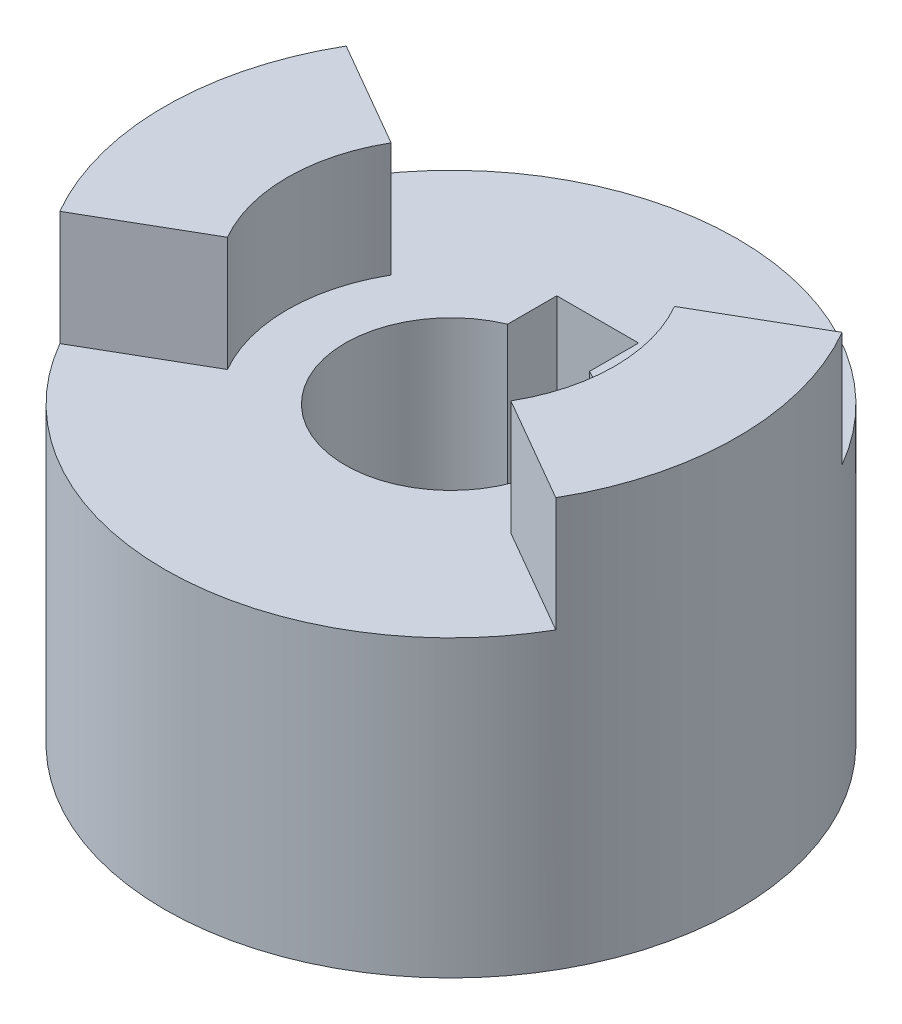
ISO-10303-21;
HEADER;
FILE_DESCRIPTION(('STEP AP214'),'2;1');
FILE_NAME('part.step','',(''),(''),'','','');
FILE_SCHEMA(('AUTOMOTIVE_DESIGN { 1 0 10303 214 1 1 1 1 }'));
ENDSEC;
DATA;
#1=APPLICATION_CONTEXT('core data for automotive mechanical design processes');
#2=APPLICATION_PROTOCOL_DEFINITION('international standard','automotive_design',2000,#1);
#3=PRODUCT_CONTEXT('',#1,'mechanical');
#4=PRODUCT('Part','Part','',(#3));
#5=PRODUCT_RELATED_PRODUCT_CATEGORY('part','',(#4));
#6=PRODUCT_DEFINITION_FORMATION('','',#4);
#7=PRODUCT_DEFINITION_CONTEXT('part definition',#1,'design');
#8=PRODUCT_DEFINITION('design','',#6,#7);
#9=PRODUCT_DEFINITION_SHAPE('','',#8);
#10=(LENGTH_UNIT() NAMED_UNIT(*) SI_UNIT(.MILLI.,.METRE.));
#11=(NAMED_UNIT(*) PLANE_ANGLE_UNIT() SI_UNIT($,.RADIAN.));
#12=(NAMED_UNIT(*) SI_UNIT($,.STERADIAN.) SOLID_ANGLE_UNIT());
#13=UNCERTAINTY_MEASURE_WITH_UNIT(LENGTH_MEASURE(1.E-05),#10,'distance_accuracy_value','');
#14=(GEOMETRIC_REPRESENTATION_CONTEXT(3) GLOBAL_UNCERTAINTY_ASSIGNED_CONTEXT((#13)) GLOBAL_UNIT_ASSIGNED_CONTEXT((#10,
#11,#12)) REPRESENTATION_CONTEXT('',''));
#15=CARTESIAN_POINT('',(0.,0.,0.));
#16=DIRECTION('',(0.,0.,1.));
#17=DIRECTION('',(1.,0.,0.));
#18=AXIS2_PLACEMENT_3D('',#15,#16,#17);
#19=CARTESIAN_POINT('',(10.3923048454132,-67.2011904656459,6.00000000000003));
#20=DIRECTION('',(0.499999999999996,0.,-0.866025403784441));
#21=DIRECTION('',(-0.866025403784441,0.,-0.499999999999996));
#22=AXIS2_PLACEMENT_3D('',#19,#20,#21);
#23=PLANE('',#22);
#24=DIRECTION('',(0.,-1.,0.));
#25=VECTOR('',#24,1.);
#26=CARTESIAN_POINT('',(17.3205080756888,50.,9.99999999999999));
#27=LINE('',#26,#25);
#28=CARTESIAN_POINT('',(17.3205080756888,36.,9.99999999999999));
#29=VERTEX_POINT('',#28);
#30=CARTESIAN_POINT('',(17.3205080756888,50.,9.99999999999999));
#31=VERTEX_POINT('',#30);
#32=EDGE_CURVE('E127',#29,#31,#27,.F.);
#33=ORIENTED_EDGE('',*,*,#32,.F.);
#34=DIRECTION('',(0.866025403784441,0.,0.499999999999996));
#35=VECTOR('',#34,1.);
#36=CARTESIAN_POINT('',(10.3923048454132,36.,6.00000000000003));
#37=LINE('',#36,#35);
#38=CARTESIAN_POINT('',(30.3108891324554,36.,17.4999999999999));
#39=VERTEX_POINT('',#38);
#40=EDGE_CURVE('E139',#29,#39,#37,.T.);
#41=ORIENTED_EDGE('',*,*,#40,.T.);
#42=DIRECTION('',(0.,1.,0.));
#43=VECTOR('',#42,1.);
#44=CARTESIAN_POINT('',(30.3108891324554,-67.2011904656459,17.4999999999999));
#45=LINE('',#44,#43);
#46=CARTESIAN_POINT('',(30.3108891324554,50.,17.4999999999999));
#47=VERTEX_POINT('',#46);
#48=EDGE_CURVE('E156',#39,#47,#45,.T.);
#49=ORIENTED_EDGE('',*,*,#48,.T.);
#50=DIRECTION('',(-0.866025403784441,0.,-0.499999999999996));
#51=VECTOR('',#50,1.);
#52=CARTESIAN_POINT('',(10.3923048454132,50.,6.00000000000003));
#53=LINE('',#52,#51);
#54=EDGE_CURVE('E142',#47,#31,#53,.T.);
#55=ORIENTED_EDGE('',*,*,#54,.T.);
#56=EDGE_LOOP('',(#33,#41,#49,#55));
#57=FACE_BOUND('',#56,.T.);
#58=ADVANCED_FACE('F35',(#57),#23,.F.);
#59=CARTESIAN_POINT('',(-10.3923048454133,-67.2011904656459,5.99999999999998));
#60=DIRECTION('',(-0.499999999999998,0.,-0.86602540378444));
#61=DIRECTION('',(-0.86602540378444,0.,0.499999999999998));
#62=AXIS2_PLACEMENT_3D('',#59,#60,#61);
#63=PLANE('',#62);
#64=DIRECTION('',(0.,-1.,0.));
#65=VECTOR('',#64,1.);
#66=CARTESIAN_POINT('',(-17.3205080756888,50.,9.99999999999996));
#67=LINE('',#66,#65);
#68=CARTESIAN_POINT('',(-17.3205080756888,50.,9.99999999999996));
#69=VERTEX_POINT('',#68);
#70=CARTESIAN_POINT('',(-17.3205080756888,36.,9.99999999999996));
#71=VERTEX_POINT('',#70);
#72=EDGE_CURVE('E143',#69,#71,#67,.T.);
#73=ORIENTED_EDGE('',*,*,#72,.F.);
#74=DIRECTION('',(-0.86602540378444,0.,0.499999999999998));
#75=VECTOR('',#74,1.);
#76=CARTESIAN_POINT('',(-10.3923048454133,50.,5.99999999999998));
#77=LINE('',#76,#75);
#78=CARTESIAN_POINT('',(-30.3108891324554,50.,17.4999999999999));
#79=VERTEX_POINT('',#78);
#80=EDGE_CURVE('E160',#69,#79,#77,.T.);
#81=ORIENTED_EDGE('',*,*,#80,.T.);
#82=DIRECTION('',(0.,1.,0.));
#83=VECTOR('',#82,1.);
#84=CARTESIAN_POINT('',(-30.3108891324554,-67.2011904656459,17.4999999999999));
#85=LINE('',#84,#83);
#86=CARTESIAN_POINT('',(-30.3108891324554,36.,17.4999999999999));
#87=VERTEX_POINT('',#86);
#88=EDGE_CURVE('E164',#87,#79,#85,.T.);
#89=ORIENTED_EDGE('',*,*,#88,.F.);
#90=DIRECTION('',(0.86602540378444,0.,-0.499999999999998));
#91=VECTOR('',#90,1.);
#92=CARTESIAN_POINT('',(-10.3923048454133,36.,5.99999999999998));
#93=LINE('',#92,#91);
#94=EDGE_CURVE('E151',#87,#71,#93,.T.);
#95=ORIENTED_EDGE('',*,*,#94,.T.);
#96=EDGE_LOOP('',(#73,#81,#89,#95));
#97=FACE_BOUND('',#96,.T.);
#98=ADVANCED_FACE('F233',(#97),#63,.F.);
#99=CARTESIAN_POINT('',(10.3923048454132,-67.2011904656459,-6.00000000000003));
#100=DIRECTION('',(-0.499999999999996,0.,-0.866025403784441));
#101=DIRECTION('',(-0.866025403784441,0.,0.499999999999996));
#102=AXIS2_PLACEMENT_3D('',#99,#100,#101);
#103=PLANE('',#102);
#104=DIRECTION('',(0.866025403784441,0.,-0.499999999999996));
#105=VECTOR('',#104,1.);
#106=CARTESIAN_POINT('',(10.3923048454132,36.,-6.00000000000003));
#107=LINE('',#106,#105);
#108=CARTESIAN_POINT('',(17.3205080756888,36.,-9.99999999999999));
#109=VERTEX_POINT('',#108);
#110=CARTESIAN_POINT('',(30.3108891324554,36.,-17.4999999999999));
#111=VERTEX_POINT('',#110);
#112=EDGE_CURVE('E203',#109,#111,#107,.T.);
#113=ORIENTED_EDGE('',*,*,#112,.F.);
#114=DIRECTION('',(0.,-1.,0.));
#115=VECTOR('',#114,1.);
#116=CARTESIAN_POINT('',(17.3205080756888,50.,-9.99999999999999));
#117=LINE('',#116,#115);
#118=CARTESIAN_POINT('',(17.3205080756888,50.,-9.99999999999999));
#119=VERTEX_POINT('',#118);
#120=EDGE_CURVE('E130',#109,#119,#117,.F.);
#121=ORIENTED_EDGE('',*,*,#120,.T.);
#122=DIRECTION('',(-0.866025403784441,0.,0.499999999999996));
#123=VECTOR('',#122,1.);
#124=CARTESIAN_POINT('',(10.3923048454132,50.,-6.00000000000003));
#125=LINE('',#124,#123);
#126=CARTESIAN_POINT('',(30.3108891324554,50.,-17.4999999999999));
#127=VERTEX_POINT('',#126);
#128=EDGE_CURVE('E194',#127,#119,#125,.T.);
#129=ORIENTED_EDGE('',*,*,#128,.F.);
#130=DIRECTION('',(0.,1.,0.));
#131=VECTOR('',#130,1.);
#132=CARTESIAN_POINT('',(30.3108891324554,-67.2011904656459,-17.4999999999999));
#133=LINE('',#132,#131);
#134=EDGE_CURVE('E210',#111,#127,#133,.T.);
#135=ORIENTED_EDGE('',*,*,#134,.F.);
#136=EDGE_LOOP('',(#113,#121,#129,#135));
#137=FACE_BOUND('',#136,.T.);
#138=ADVANCED_FACE('F219',(#137),#103,.T.);
#139=CARTESIAN_POINT('',(-10.3923048454133,-67.2011904656459,-5.99999999999998));
#140=DIRECTION('',(0.499999999999998,0.,-0.86602540378444));
#141=DIRECTION('',(-0.86602540378444,0.,-0.499999999999998));
#142=AXIS2_PLACEMENT_3D('',#139,#140,#141);
#143=PLANE('',#142);
#144=DIRECTION('',(-0.86602540378444,0.,-0.499999999999998));
#145=VECTOR('',#144,1.);
#146=CARTESIAN_POINT('',(-10.3923048454133,50.,-5.99999999999998));
#147=LINE('',#146,#145);
#148=CARTESIAN_POINT('',(-17.3205080756888,50.,-9.99999999999996));
#149=VERTEX_POINT('',#148);
#150=CARTESIAN_POINT('',(-30.3108891324554,50.,-17.4999999999999));
#151=VERTEX_POINT('',#150);
#152=EDGE_CURVE('E208',#149,#151,#147,.T.);
#153=ORIENTED_EDGE('',*,*,#152,.F.);
#154=DIRECTION('',(0.,-1.,0.));
#155=VECTOR('',#154,1.);
#156=CARTESIAN_POINT('',(-17.3205080756888,50.,-9.99999999999996));
#157=LINE('',#156,#155);
#158=CARTESIAN_POINT('',(-17.3205080756888,36.,-9.99999999999996));
#159=VERTEX_POINT('',#158);
#160=EDGE_CURVE('E228',#149,#159,#157,.T.);
#161=ORIENTED_EDGE('',*,*,#160,.T.);
#162=DIRECTION('',(0.86602540378444,0.,0.499999999999998));
#163=VECTOR('',#162,1.);
#164=CARTESIAN_POINT('',(-10.3923048454133,36.,-5.99999999999998));
#165=LINE('',#164,#163);
#166=CARTESIAN_POINT('',(-30.3108891324554,36.,-17.4999999999999));
#167=VERTEX_POINT('',#166);
#168=EDGE_CURVE('E162',#167,#159,#165,.T.);
#169=ORIENTED_EDGE('',*,*,#168,.F.);
#170=DIRECTION('',(0.,1.,0.));
#171=VECTOR('',#170,1.);
#172=CARTESIAN_POINT('',(-30.3108891324554,-67.2011904656459,-17.4999999999999));
#173=LINE('',#172,#171);
#174=EDGE_CURVE('E211',#167,#151,#173,.T.);
#175=ORIENTED_EDGE('',*,*,#174,.T.);
#176=EDGE_LOOP('',(#153,#161,#169,#175));
#177=FACE_BOUND('',#176,.T.);
#178=ADVANCED_FACE('F226',(#177),#143,.T.);
#179=CARTESIAN_POINT('',(0.,50.,0.));
#180=DIRECTION('',(0.,-1.,0.));
#181=DIRECTION('',(0.,0.,-1.));
#182=AXIS2_PLACEMENT_3D('',#179,#180,#181);
#183=CYLINDRICAL_SURFACE('',#182,12.93);
#184=CARTESIAN_POINT('',(0.,36.,0.));
#185=DIRECTION('',(0.,1.,0.));
#186=DIRECTION('',(0.,0.,1.));
#187=AXIS2_PLACEMENT_3D('',#184,#185,#186);
#188=CIRCLE('',#187,12.93);
#189=CARTESIAN_POINT('',(5.,36.,-11.9241309955904));
#190=VERTEX_POINT('',#189);
#191=CARTESIAN_POINT('',(-5.,36.,-11.9241309955904));
#192=VERTEX_POINT('',#191);
#193=EDGE_CURVE('E12',#190,#192,#188,.F.);
#194=ORIENTED_EDGE('',*,*,#193,.F.);
#195=DIRECTION('',(0.,-1.,0.));
#196=VECTOR('',#195,1.);
#197=CARTESIAN_POINT('',(5.,50.,-11.9241309955904));
#198=LINE('',#197,#196);
#199=CARTESIAN_POINT('',(5.,0.,-11.9241309955904));
#200=VERTEX_POINT('',#199);
#201=EDGE_CURVE('E187',#190,#200,#198,.T.);
#202=ORIENTED_EDGE('',*,*,#201,.T.);
#203=CARTESIAN_POINT('',(0.,0.,0.));
#204=DIRECTION('',(0.,1.,0.));
#205=DIRECTION('',(0.,0.,1.));
#206=AXIS2_PLACEMENT_3D('',#203,#204,#205);
#207=CIRCLE('',#206,12.93);
#208=CARTESIAN_POINT('',(-5.,0.,-11.9241309955904));
#209=VERTEX_POINT('',#208);
#210=EDGE_CURVE('E50',#209,#200,#207,.T.);
#211=ORIENTED_EDGE('',*,*,#210,.F.);
#212=DIRECTION('',(0.,-1.,0.));
#213=VECTOR('',#212,1.);
#214=CARTESIAN_POINT('',(-5.,50.,-11.9241309955904));
#215=LINE('',#214,#213);
#216=EDGE_CURVE('E196',#192,#209,#215,.T.);
#217=ORIENTED_EDGE('',*,*,#216,.F.);
#218=EDGE_LOOP('',(#194,#202,#211,#217));
#219=FACE_BOUND('',#218,.T.);
#220=ADVANCED_FACE('F260',(#219),#183,.F.);
#221=CARTESIAN_POINT('',(0.,50.,0.));
#222=DIRECTION('',(0.,1.,0.));
#223=DIRECTION('',(0.,0.,1.));
#224=AXIS2_PLACEMENT_3D('',#221,#222,#223);
#225=PLANE('',#224);
#226=ORIENTED_EDGE('',*,*,#80,.F.);
#227=CARTESIAN_POINT('',(0.,50.,0.));
#228=DIRECTION('',(0.,1.,0.));
#229=DIRECTION('',(0.,0.,1.));
#230=AXIS2_PLACEMENT_3D('',#227,#228,#229);
#231=CIRCLE('',#230,20.);
#232=EDGE_CURVE('E134',#149,#69,#231,.T.);
#233=ORIENTED_EDGE('',*,*,#232,.F.);
#234=ORIENTED_EDGE('',*,*,#152,.T.);
#235=CARTESIAN_POINT('',(0.,50.,0.));
#236=DIRECTION('',(0.,1.,0.));
#237=DIRECTION('',(0.,0.,1.));
#238=AXIS2_PLACEMENT_3D('',#235,#236,#237);
#239=CIRCLE('',#238,35.);
#240=EDGE_CURVE('E172',#151,#79,#239,.T.);
#241=ORIENTED_EDGE('',*,*,#240,.T.);
#242=EDGE_LOOP('',(#226,#233,#234,#241));
#243=FACE_BOUND('',#242,.T.);
#244=ADVANCED_FACE('F253',(#243),#225,.T.);
#245=CARTESIAN_POINT('',(0.,0.,0.));
#246=DIRECTION('',(0.,1.,0.));
#247=DIRECTION('',(0.,0.,1.));
#248=AXIS2_PLACEMENT_3D('',#245,#246,#247);
#249=PLANE('',#248);
#250=CARTESIAN_POINT('',(0.,0.,0.));
#251=DIRECTION('',(0.,1.,0.));
#252=DIRECTION('',(0.,0.,1.));
#253=AXIS2_PLACEMENT_3D('',#250,#251,#252);
#254=CIRCLE('',#253,35.);
#255=CARTESIAN_POINT('',(0.,0.,35.));
#256=VERTEX_POINT('',#255);
#257=EDGE_CURVE('E154',#256,#256,#254,.T.);
#258=ORIENTED_EDGE('',*,*,#257,.F.);
#259=EDGE_LOOP('',(#258));
#260=FACE_BOUND('',#259,.T.);
#261=ORIENTED_EDGE('',*,*,#210,.T.);
#262=DIRECTION('',(0.,0.,-1.));
#263=VECTOR('',#262,1.);
#264=CARTESIAN_POINT('',(5.,0.,-11.9241309955904));
#265=LINE('',#264,#263);
#266=CARTESIAN_POINT('',(5.,0.,-17.93));
#267=VERTEX_POINT('',#266);
#268=EDGE_CURVE('E244',#200,#267,#265,.T.);
#269=ORIENTED_EDGE('',*,*,#268,.T.);
#270=DIRECTION('',(-1.,0.,0.));
#271=VECTOR('',#270,1.);
#272=CARTESIAN_POINT('',(5.,0.,-17.93));
#273=LINE('',#272,#271);
#274=CARTESIAN_POINT('',(-5.,0.,-17.93));
#275=VERTEX_POINT('',#274);
#276=EDGE_CURVE('E191',#267,#275,#273,.T.);
#277=ORIENTED_EDGE('',*,*,#276,.T.);
#278=DIRECTION('',(0.,0.,1.));
#279=VECTOR('',#278,1.);
#280=CARTESIAN_POINT('',(-5.,0.,-11.9241309955904));
#281=LINE('',#280,#279);
#282=EDGE_CURVE('E247',#275,#209,#281,.T.);
#283=ORIENTED_EDGE('',*,*,#282,.T.);
#284=EDGE_LOOP('',(#261,#269,#277,#283));
#285=FACE_BOUND('',#284,.T.);
#286=ADVANCED_FACE('F251',(#260,#285),#249,.F.);
#287=CARTESIAN_POINT('',(0.,50.,0.));
#288=DIRECTION('',(0.,-1.,0.));
#289=DIRECTION('',(0.,0.,-1.));
#290=AXIS2_PLACEMENT_3D('',#287,#288,#289);
#291=CYLINDRICAL_SURFACE('',#290,35.);
#292=ORIENTED_EDGE('',*,*,#257,.T.);
#293=EDGE_LOOP('',(#292));
#294=FACE_BOUND('',#293,.T.);
#295=ORIENTED_EDGE('',*,*,#134,.T.);
#296=EDGE_CURVE('E168',#47,#127,#239,.T.);
#297=ORIENTED_EDGE('',*,*,#296,.F.);
#298=ORIENTED_EDGE('',*,*,#48,.F.);
#299=CARTESIAN_POINT('',(0.,36.,0.));
#300=DIRECTION('',(0.,1.,0.));
#301=DIRECTION('',(0.,0.,1.));
#302=AXIS2_PLACEMENT_3D('',#299,#300,#301);
#303=CIRCLE('',#302,35.);
#304=EDGE_CURVE('E149',#39,#87,#303,.F.);
#305=ORIENTED_EDGE('',*,*,#304,.T.);
#306=ORIENTED_EDGE('',*,*,#88,.T.);
#307=ORIENTED_EDGE('',*,*,#240,.F.);
#308=ORIENTED_EDGE('',*,*,#174,.F.);
#309=CARTESIAN_POINT('',(0.,36.,0.));
#310=DIRECTION('',(0.,1.,0.));
#311=DIRECTION('',(0.,0.,1.));
#312=AXIS2_PLACEMENT_3D('',#309,#310,#311);
#313=CIRCLE('',#312,35.);
#314=EDGE_CURVE('E200',#111,#167,#313,.T.);
#315=ORIENTED_EDGE('',*,*,#314,.F.);
#316=EDGE_LOOP('',(#295,#297,#298,#305,#306,#307,#308,#315));
#317=FACE_BOUND('',#316,.T.);
#318=ADVANCED_FACE('F37',(#294,#317),#291,.T.);
#319=ORIENTED_EDGE('',*,*,#128,.T.);
#320=EDGE_CURVE('E237',#31,#119,#231,.T.);
#321=ORIENTED_EDGE('',*,*,#320,.F.);
#322=ORIENTED_EDGE('',*,*,#54,.F.);
#323=ORIENTED_EDGE('',*,*,#296,.T.);
#324=EDGE_LOOP('',(#319,#321,#322,#323));
#325=FACE_BOUND('',#324,.T.);
#326=ADVANCED_FACE('F236',(#325),#225,.T.);
#327=CARTESIAN_POINT('',(0.,36.,0.));
#328=DIRECTION('',(0.,1.,0.));
#329=DIRECTION('',(0.,0.,1.));
#330=AXIS2_PLACEMENT_3D('',#327,#328,#329);
#331=PLANE('',#330);
#332=ORIENTED_EDGE('',*,*,#40,.F.);
#333=CARTESIAN_POINT('',(0.,36.,0.));
#334=DIRECTION('',(0.,1.,0.));
#335=DIRECTION('',(0.,0.,1.));
#336=AXIS2_PLACEMENT_3D('',#333,#334,#335);
#337=CIRCLE('',#336,20.);
#338=EDGE_CURVE('E124',#29,#109,#337,.T.);
#339=ORIENTED_EDGE('',*,*,#338,.T.);
#340=ORIENTED_EDGE('',*,*,#112,.T.);
#341=ORIENTED_EDGE('',*,*,#314,.T.);
#342=ORIENTED_EDGE('',*,*,#168,.T.);
#343=EDGE_CURVE('E135',#159,#71,#337,.T.);
#344=ORIENTED_EDGE('',*,*,#343,.T.);
#345=ORIENTED_EDGE('',*,*,#94,.F.);
#346=ORIENTED_EDGE('',*,*,#304,.F.);
#347=EDGE_LOOP('',(#332,#339,#340,#341,#342,#344,#345,#346));
#348=FACE_BOUND('',#347,.T.);
#349=DIRECTION('',(0.,0.,1.));
#350=VECTOR('',#349,1.);
#351=CARTESIAN_POINT('',(5.,36.,0.));
#352=LINE('',#351,#350);
#353=CARTESIAN_POINT('',(5.,36.,-17.93));
#354=VERTEX_POINT('',#353);
#355=EDGE_CURVE('E43',#354,#190,#352,.T.);
#356=ORIENTED_EDGE('',*,*,#355,.T.);
#357=ORIENTED_EDGE('',*,*,#193,.T.);
#358=DIRECTION('',(0.,0.,-1.));
#359=VECTOR('',#358,1.);
#360=CARTESIAN_POINT('',(-5.,36.,0.));
#361=LINE('',#360,#359);
#362=CARTESIAN_POINT('',(-5.,36.,-17.93));
#363=VERTEX_POINT('',#362);
#364=EDGE_CURVE('E171',#192,#363,#361,.T.);
#365=ORIENTED_EDGE('',*,*,#364,.T.);
#366=DIRECTION('',(1.,0.,0.));
#367=VECTOR('',#366,1.);
#368=CARTESIAN_POINT('',(0.,36.,-17.93));
#369=LINE('',#368,#367);
#370=EDGE_CURVE('E177',#363,#354,#369,.T.);
#371=ORIENTED_EDGE('',*,*,#370,.T.);
#372=EDGE_LOOP('',(#356,#357,#365,#371));
#373=FACE_BOUND('',#372,.T.);
#374=ADVANCED_FACE('F145',(#348,#373),#331,.T.);
#375=CARTESIAN_POINT('',(5.,50.,-11.9241309955904));
#376=DIRECTION('',(-1.,0.,0.));
#377=DIRECTION('',(0.,0.,1.));
#378=AXIS2_PLACEMENT_3D('',#375,#376,#377);
#379=PLANE('',#378);
#380=DIRECTION('',(0.,-1.,0.));
#381=VECTOR('',#380,1.);
#382=CARTESIAN_POINT('',(5.,50.,-17.93));
#383=LINE('',#382,#381);
#384=EDGE_CURVE('E185',#354,#267,#383,.T.);
#385=ORIENTED_EDGE('',*,*,#384,.T.);
#386=ORIENTED_EDGE('',*,*,#268,.F.);
#387=ORIENTED_EDGE('',*,*,#201,.F.);
#388=ORIENTED_EDGE('',*,*,#355,.F.);
#389=EDGE_LOOP('',(#385,#386,#387,#388));
#390=FACE_BOUND('',#389,.T.);
#391=ADVANCED_FACE('F183',(#390),#379,.T.);
#392=CARTESIAN_POINT('',(5.,50.,-17.93));
#393=DIRECTION('',(0.,0.,1.));
#394=DIRECTION('',(1.,0.,0.));
#395=AXIS2_PLACEMENT_3D('',#392,#393,#394);
#396=PLANE('',#395);
#397=DIRECTION('',(0.,-1.,0.));
#398=VECTOR('',#397,1.);
#399=CARTESIAN_POINT('',(-5.,50.,-17.93));
#400=LINE('',#399,#398);
#401=EDGE_CURVE('E58',#363,#275,#400,.T.);
#402=ORIENTED_EDGE('',*,*,#401,.T.);
#403=ORIENTED_EDGE('',*,*,#276,.F.);
#404=ORIENTED_EDGE('',*,*,#384,.F.);
#405=ORIENTED_EDGE('',*,*,#370,.F.);
#406=EDGE_LOOP('',(#402,#403,#404,#405));
#407=FACE_BOUND('',#406,.T.);
#408=ADVANCED_FACE('F189',(#407),#396,.T.);
#409=CARTESIAN_POINT('',(-5.,50.,-11.9241309955904));
#410=DIRECTION('',(1.,0.,0.));
#411=DIRECTION('',(0.,0.,-1.));
#412=AXIS2_PLACEMENT_3D('',#409,#410,#411);
#413=PLANE('',#412);
#414=ORIENTED_EDGE('',*,*,#216,.T.);
#415=ORIENTED_EDGE('',*,*,#282,.F.);
#416=ORIENTED_EDGE('',*,*,#401,.F.);
#417=ORIENTED_EDGE('',*,*,#364,.F.);
#418=EDGE_LOOP('',(#414,#415,#416,#417));
#419=FACE_BOUND('',#418,.T.);
#420=ADVANCED_FACE('F249',(#419),#413,.T.);
#421=CARTESIAN_POINT('',(0.,50.,0.));
#422=DIRECTION('',(0.,-1.,0.));
#423=DIRECTION('',(0.,0.,-1.));
#424=AXIS2_PLACEMENT_3D('',#421,#422,#423);
#425=CYLINDRICAL_SURFACE('',#424,20.);
#426=ORIENTED_EDGE('',*,*,#72,.T.);
#427=ORIENTED_EDGE('',*,*,#343,.F.);
#428=ORIENTED_EDGE('',*,*,#160,.F.);
#429=ORIENTED_EDGE('',*,*,#232,.T.);
#430=EDGE_LOOP('',(#426,#427,#428,#429));
#431=FACE_BOUND('',#430,.T.);
#432=ADVANCED_FACE('F325',(#431),#425,.F.);
#433=ORIENTED_EDGE('',*,*,#32,.T.);
#434=ORIENTED_EDGE('',*,*,#320,.T.);
#435=ORIENTED_EDGE('',*,*,#120,.F.);
#436=ORIENTED_EDGE('',*,*,#338,.F.);
#437=EDGE_LOOP('',(#433,#434,#435,#436));
#438=FACE_BOUND('',#437,.T.);
#439=ADVANCED_FACE('F126',(#438),#425,.F.);
#440=CLOSED_SHELL('',(#58,#98,#138,#178,#220,#244,#286,#318,#326,#374,#391,#408,#420,#432,#439));
#441=MANIFOLD_SOLID_BREP('B2',#440);
#442=ADVANCED_BREP_SHAPE_REPRESENTATION('',(#18,#441),#14);
#443=SHAPE_DEFINITION_REPRESENTATION(#9,#442);
ENDSEC;
END-ISO-10303-21;
